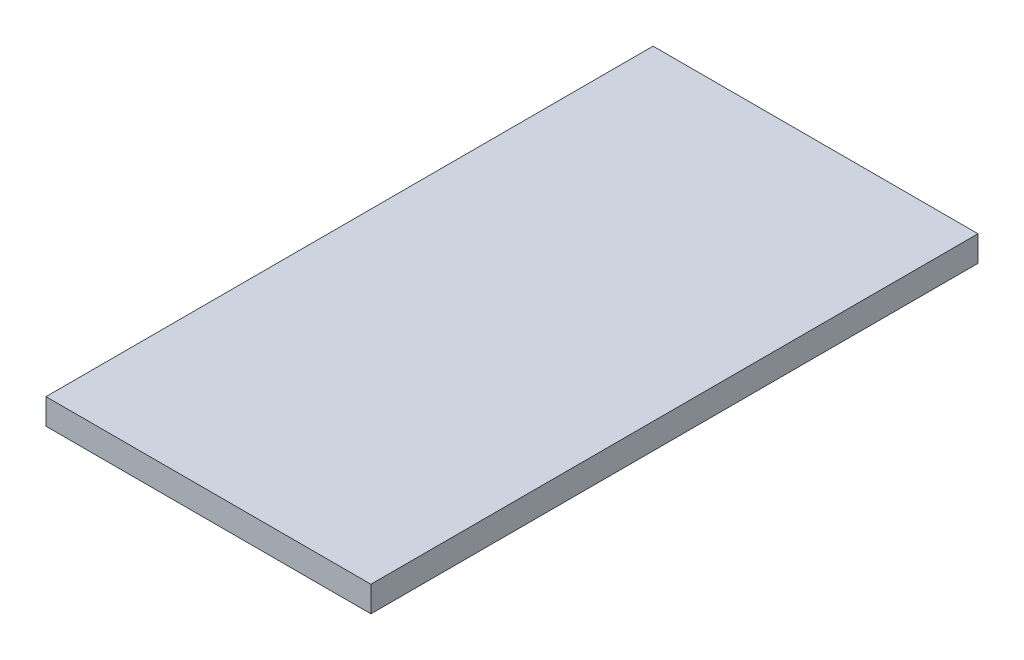
ISO-10303-21;
HEADER;
FILE_DESCRIPTION(('STEP AP214'),'2;1');
FILE_NAME('part.step','',(''),(''),'','','');
FILE_SCHEMA(('AUTOMOTIVE_DESIGN { 1 0 10303 214 1 1 1 1 }'));
ENDSEC;
DATA;
#1=APPLICATION_CONTEXT('core data for automotive mechanical design processes');
#2=APPLICATION_PROTOCOL_DEFINITION('international standard','automotive_design',2000,#1);
#3=PRODUCT_CONTEXT('',#1,'mechanical');
#4=PRODUCT('Part','Part','',(#3));
#5=PRODUCT_RELATED_PRODUCT_CATEGORY('part','',(#4));
#6=PRODUCT_DEFINITION_FORMATION('','',#4);
#7=PRODUCT_DEFINITION_CONTEXT('part definition',#1,'design');
#8=PRODUCT_DEFINITION('design','',#6,#7);
#9=PRODUCT_DEFINITION_SHAPE('','',#8);
#10=(LENGTH_UNIT() NAMED_UNIT(*) SI_UNIT(.MILLI.,.METRE.));
#11=(NAMED_UNIT(*) PLANE_ANGLE_UNIT() SI_UNIT($,.RADIAN.));
#12=(NAMED_UNIT(*) SI_UNIT($,.STERADIAN.) SOLID_ANGLE_UNIT());
#13=UNCERTAINTY_MEASURE_WITH_UNIT(LENGTH_MEASURE(1.E-05),#10,'distance_accuracy_value','');
#14=(GEOMETRIC_REPRESENTATION_CONTEXT(3) GLOBAL_UNCERTAINTY_ASSIGNED_CONTEXT((#13)) GLOBAL_UNIT_ASSIGNED_CONTEXT((#10,
#11,#12)) REPRESENTATION_CONTEXT('',''));
#15=CARTESIAN_POINT('',(0.,0.,0.));
#16=DIRECTION('',(0.,0.,1.));
#17=DIRECTION('',(1.,0.,0.));
#18=AXIS2_PLACEMENT_3D('',#15,#16,#17);
#19=CARTESIAN_POINT('',(0.,30.,0.));
#20=DIRECTION('',(1.,0.,0.));
#21=DIRECTION('',(0.,0.,-1.));
#22=AXIS2_PLACEMENT_3D('',#19,#20,#21);
#23=PLANE('',#22);
#24=DIRECTION('',(0.,0.,1.));
#25=VECTOR('',#24,1.);
#26=CARTESIAN_POINT('',(0.,0.,0.));
#27=LINE('',#26,#25);
#28=CARTESIAN_POINT('',(-1.11022302462516E-13,0.,-710.));
#29=VERTEX_POINT('',#28);
#30=CARTESIAN_POINT('',(0.,0.,0.));
#31=VERTEX_POINT('',#30);
#32=EDGE_CURVE('E95',#29,#31,#27,.T.);
#33=ORIENTED_EDGE('',*,*,#32,.T.);
#34=DIRECTION('',(0.,-1.,0.));
#35=VECTOR('',#34,1.);
#36=CARTESIAN_POINT('',(0.,30.,0.));
#37=LINE('',#36,#35);
#38=CARTESIAN_POINT('',(0.,30.,0.));
#39=VERTEX_POINT('',#38);
#40=EDGE_CURVE('E11',#39,#31,#37,.T.);
#41=ORIENTED_EDGE('',*,*,#40,.F.);
#42=DIRECTION('',(0.,0.,1.));
#43=VECTOR('',#42,1.);
#44=CARTESIAN_POINT('',(0.,30.,0.));
#45=LINE('',#44,#43);
#46=CARTESIAN_POINT('',(-1.11022302462516E-13,30.,-710.));
#47=VERTEX_POINT('',#46);
#48=EDGE_CURVE('E83',#47,#39,#45,.T.);
#49=ORIENTED_EDGE('',*,*,#48,.F.);
#50=DIRECTION('',(0.,-1.,0.));
#51=VECTOR('',#50,1.);
#52=CARTESIAN_POINT('',(-1.11022302462516E-13,30.,-710.));
#53=LINE('',#52,#51);
#54=EDGE_CURVE('E91',#47,#29,#53,.T.);
#55=ORIENTED_EDGE('',*,*,#54,.T.);
#56=EDGE_LOOP('',(#33,#41,#49,#55));
#57=FACE_BOUND('',#56,.T.);
#58=ADVANCED_FACE('F32',(#57),#23,.F.);
#59=CARTESIAN_POINT('',(0.,30.,0.));
#60=DIRECTION('',(0.,0.,-1.));
#61=DIRECTION('',(-1.,0.,0.));
#62=AXIS2_PLACEMENT_3D('',#59,#60,#61);
#63=PLANE('',#62);
#64=DIRECTION('',(1.,0.,0.));
#65=VECTOR('',#64,1.);
#66=CARTESIAN_POINT('',(0.,0.,0.));
#67=LINE('',#66,#65);
#68=CARTESIAN_POINT('',(380.,0.,0.));
#69=VERTEX_POINT('',#68);
#70=EDGE_CURVE('E87',#31,#69,#67,.T.);
#71=ORIENTED_EDGE('',*,*,#70,.T.);
#72=DIRECTION('',(0.,-1.,0.));
#73=VECTOR('',#72,1.);
#74=CARTESIAN_POINT('',(380.,30.,0.));
#75=LINE('',#74,#73);
#76=CARTESIAN_POINT('',(380.,30.,0.));
#77=VERTEX_POINT('',#76);
#78=EDGE_CURVE('E40',#77,#69,#75,.T.);
#79=ORIENTED_EDGE('',*,*,#78,.F.);
#80=DIRECTION('',(1.,0.,0.));
#81=VECTOR('',#80,1.);
#82=CARTESIAN_POINT('',(0.,30.,0.));
#83=LINE('',#82,#81);
#84=EDGE_CURVE('E78',#39,#77,#83,.T.);
#85=ORIENTED_EDGE('',*,*,#84,.F.);
#86=ORIENTED_EDGE('',*,*,#40,.T.);
#87=EDGE_LOOP('',(#71,#79,#85,#86));
#88=FACE_BOUND('',#87,.T.);
#89=ADVANCED_FACE('F86',(#88),#63,.F.);
#90=CARTESIAN_POINT('',(380.,30.,0.));
#91=DIRECTION('',(-1.,0.,0.));
#92=DIRECTION('',(0.,0.,1.));
#93=AXIS2_PLACEMENT_3D('',#90,#91,#92);
#94=PLANE('',#93);
#95=DIRECTION('',(0.,0.,-1.));
#96=VECTOR('',#95,1.);
#97=CARTESIAN_POINT('',(380.,0.,0.));
#98=LINE('',#97,#96);
#99=CARTESIAN_POINT('',(380.,0.,-710.));
#100=VERTEX_POINT('',#99);
#101=EDGE_CURVE('E65',#69,#100,#98,.T.);
#102=ORIENTED_EDGE('',*,*,#101,.T.);
#103=DIRECTION('',(0.,-1.,0.));
#104=VECTOR('',#103,1.);
#105=CARTESIAN_POINT('',(380.,30.,-710.));
#106=LINE('',#105,#104);
#107=CARTESIAN_POINT('',(380.,30.,-710.));
#108=VERTEX_POINT('',#107);
#109=EDGE_CURVE('E88',#108,#100,#106,.T.);
#110=ORIENTED_EDGE('',*,*,#109,.F.);
#111=DIRECTION('',(0.,0.,-1.));
#112=VECTOR('',#111,1.);
#113=CARTESIAN_POINT('',(380.,30.,0.));
#114=LINE('',#113,#112);
#115=EDGE_CURVE('E81',#77,#108,#114,.T.);
#116=ORIENTED_EDGE('',*,*,#115,.F.);
#117=ORIENTED_EDGE('',*,*,#78,.T.);
#118=EDGE_LOOP('',(#102,#110,#116,#117));
#119=FACE_BOUND('',#118,.T.);
#120=ADVANCED_FACE('F89',(#119),#94,.F.);
#121=CARTESIAN_POINT('',(-1.11022302462516E-13,30.,-710.));
#122=DIRECTION('',(0.,0.,1.));
#123=DIRECTION('',(1.,0.,0.));
#124=AXIS2_PLACEMENT_3D('',#121,#122,#123);
#125=PLANE('',#124);
#126=DIRECTION('',(-1.,0.,0.));
#127=VECTOR('',#126,1.);
#128=CARTESIAN_POINT('',(-1.11022302462516E-13,0.,-710.));
#129=LINE('',#128,#127);
#130=EDGE_CURVE('E71',#100,#29,#129,.T.);
#131=ORIENTED_EDGE('',*,*,#130,.T.);
#132=ORIENTED_EDGE('',*,*,#54,.F.);
#133=DIRECTION('',(-1.,0.,0.));
#134=VECTOR('',#133,1.);
#135=CARTESIAN_POINT('',(-1.11022302462516E-13,30.,-710.));
#136=LINE('',#135,#134);
#137=EDGE_CURVE('E48',#108,#47,#136,.T.);
#138=ORIENTED_EDGE('',*,*,#137,.F.);
#139=ORIENTED_EDGE('',*,*,#109,.T.);
#140=EDGE_LOOP('',(#131,#132,#138,#139));
#141=FACE_BOUND('',#140,.T.);
#142=ADVANCED_FACE('F102',(#141),#125,.F.);
#143=CARTESIAN_POINT('',(0.,30.,0.));
#144=DIRECTION('',(0.,-1.,0.));
#145=DIRECTION('',(0.,0.,-1.));
#146=AXIS2_PLACEMENT_3D('',#143,#144,#145);
#147=PLANE('',#146);
#148=ORIENTED_EDGE('',*,*,#48,.T.);
#149=ORIENTED_EDGE('',*,*,#84,.T.);
#150=ORIENTED_EDGE('',*,*,#115,.T.);
#151=ORIENTED_EDGE('',*,*,#137,.T.);
#152=EDGE_LOOP('',(#148,#149,#150,#151));
#153=FACE_BOUND('',#152,.T.);
#154=ADVANCED_FACE('F79',(#153),#147,.F.);
#155=CARTESIAN_POINT('',(0.,0.,0.));
#156=DIRECTION('',(0.,-1.,0.));
#157=DIRECTION('',(0.,0.,-1.));
#158=AXIS2_PLACEMENT_3D('',#155,#156,#157);
#159=PLANE('',#158);
#160=ORIENTED_EDGE('',*,*,#32,.F.);
#161=ORIENTED_EDGE('',*,*,#130,.F.);
#162=ORIENTED_EDGE('',*,*,#101,.F.);
#163=ORIENTED_EDGE('',*,*,#70,.F.);
#164=EDGE_LOOP('',(#160,#161,#162,#163));
#165=FACE_BOUND('',#164,.T.);
#166=ADVANCED_FACE('F105',(#165),#159,.T.);
#167=CLOSED_SHELL('',(#58,#89,#120,#142,#154,#166));
#168=MANIFOLD_SOLID_BREP('B2',#167);
#169=ADVANCED_BREP_SHAPE_REPRESENTATION('',(#18,#168),#14);
#170=SHAPE_DEFINITION_REPRESENTATION(#9,#169);
ENDSEC;
END-ISO-10303-21;
